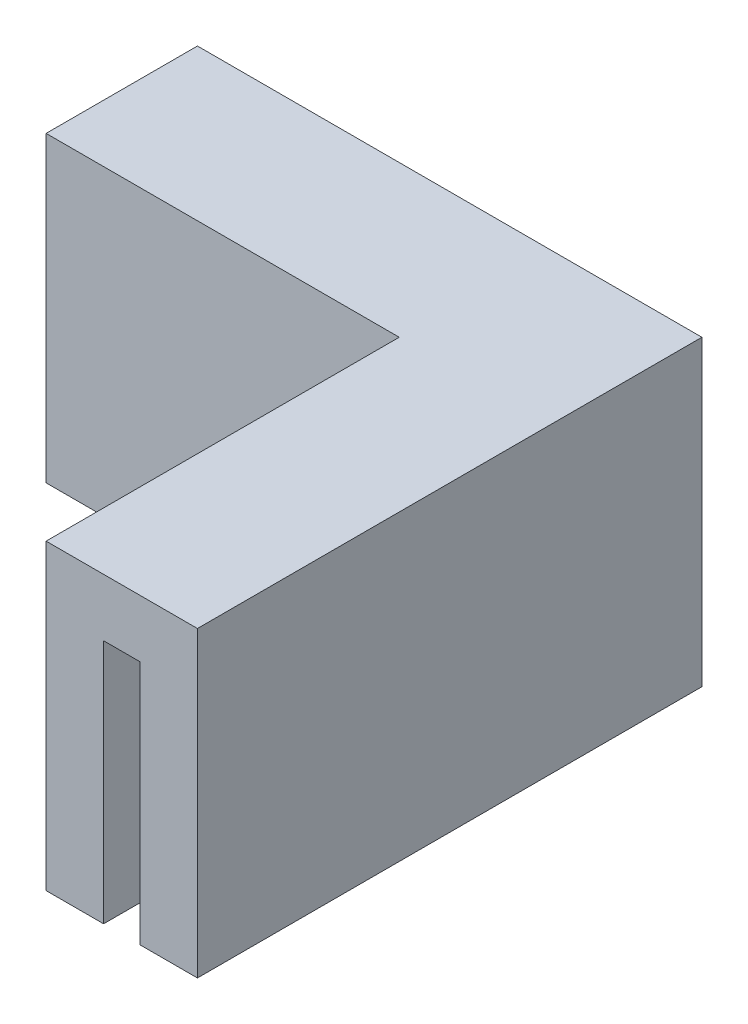
ISO-10303-21;
HEADER;
FILE_DESCRIPTION(('STEP AP214'),'2;1');
FILE_NAME('part.step','',(''),(''),'','','');
FILE_SCHEMA(('AUTOMOTIVE_DESIGN { 1 0 10303 214 1 1 1 1 }'));
ENDSEC;
DATA;
#1=APPLICATION_CONTEXT('core data for automotive mechanical design processes');
#2=APPLICATION_PROTOCOL_DEFINITION('international standard','automotive_design',2000,#1);
#3=PRODUCT_CONTEXT('',#1,'mechanical');
#4=PRODUCT('Part','Part','',(#3));
#5=PRODUCT_RELATED_PRODUCT_CATEGORY('part','',(#4));
#6=PRODUCT_DEFINITION_FORMATION('','',#4);
#7=PRODUCT_DEFINITION_CONTEXT('part definition',#1,'design');
#8=PRODUCT_DEFINITION('design','',#6,#7);
#9=PRODUCT_DEFINITION_SHAPE('','',#8);
#10=(LENGTH_UNIT() NAMED_UNIT(*) SI_UNIT(.MILLI.,.METRE.));
#11=(NAMED_UNIT(*) PLANE_ANGLE_UNIT() SI_UNIT($,.RADIAN.));
#12=(NAMED_UNIT(*) SI_UNIT($,.STERADIAN.) SOLID_ANGLE_UNIT());
#13=UNCERTAINTY_MEASURE_WITH_UNIT(LENGTH_MEASURE(1.E-05),#10,'distance_accuracy_value','');
#14=(GEOMETRIC_REPRESENTATION_CONTEXT(3) GLOBAL_UNCERTAINTY_ASSIGNED_CONTEXT((#13)) GLOBAL_UNIT_ASSIGNED_CONTEXT((#10,
#11,#12)) REPRESENTATION_CONTEXT('',''));
#15=CARTESIAN_POINT('',(0.,0.,0.));
#16=DIRECTION('',(0.,0.,1.));
#17=DIRECTION('',(1.,0.,0.));
#18=AXIS2_PLACEMENT_3D('',#15,#16,#17);
#19=CARTESIAN_POINT('',(44.3,24.3,5.7));
#20=DIRECTION('',(1.,0.,0.));
#21=DIRECTION('',(0.,0.,-1.));
#22=AXIS2_PLACEMENT_3D('',#19,#20,#21);
#23=PLANE('',#22);
#24=DIRECTION('',(0.,1.,0.));
#25=VECTOR('',#24,1.);
#26=CARTESIAN_POINT('',(44.3,0.,9.4));
#27=LINE('',#26,#25);
#28=CARTESIAN_POINT('',(44.3,0.,9.4));
#29=VERTEX_POINT('',#28);
#30=CARTESIAN_POINT('',(44.3,24.3,9.4));
#31=VERTEX_POINT('',#30);
#32=EDGE_CURVE('E138',#29,#31,#27,.T.);
#33=ORIENTED_EDGE('',*,*,#32,.F.);
#34=DIRECTION('',(0.,0.,1.));
#35=VECTOR('',#34,1.);
#36=CARTESIAN_POINT('',(44.3,0.,5.7));
#37=LINE('',#36,#35);
#38=CARTESIAN_POINT('',(44.3,0.,50.));
#39=VERTEX_POINT('',#38);
#40=EDGE_CURVE('E150',#29,#39,#37,.T.);
#41=ORIENTED_EDGE('',*,*,#40,.T.);
#42=DIRECTION('',(0.,-1.,0.));
#43=VECTOR('',#42,1.);
#44=CARTESIAN_POINT('',(44.3,24.3,50.));
#45=LINE('',#44,#43);
#46=CARTESIAN_POINT('',(44.3,24.3,50.));
#47=VERTEX_POINT('',#46);
#48=EDGE_CURVE('E170',#47,#39,#45,.T.);
#49=ORIENTED_EDGE('',*,*,#48,.F.);
#50=DIRECTION('',(0.,0.,1.));
#51=VECTOR('',#50,1.);
#52=CARTESIAN_POINT('',(44.3,24.3,5.7));
#53=LINE('',#52,#51);
#54=EDGE_CURVE('E152',#31,#47,#53,.T.);
#55=ORIENTED_EDGE('',*,*,#54,.F.);
#56=EDGE_LOOP('',(#33,#41,#49,#55));
#57=FACE_BOUND('',#56,.T.);
#58=ADVANCED_FACE('F35',(#57),#23,.F.);
#59=CARTESIAN_POINT('',(0.,24.3,5.7));
#60=DIRECTION('',(0.,0.,-1.));
#61=DIRECTION('',(-1.,0.,0.));
#62=AXIS2_PLACEMENT_3D('',#59,#60,#61);
#63=PLANE('',#62);
#64=DIRECTION('',(0.,1.,0.));
#65=VECTOR('',#64,1.);
#66=CARTESIAN_POINT('',(40.6,0.,5.7));
#67=LINE('',#66,#65);
#68=CARTESIAN_POINT('',(40.6,0.,5.7));
#69=VERTEX_POINT('',#68);
#70=CARTESIAN_POINT('',(40.6,24.3,5.7));
#71=VERTEX_POINT('',#70);
#72=EDGE_CURVE('E153',#69,#71,#67,.T.);
#73=ORIENTED_EDGE('',*,*,#72,.T.);
#74=DIRECTION('',(1.,0.,0.));
#75=VECTOR('',#74,1.);
#76=CARTESIAN_POINT('',(0.,24.3,5.7));
#77=LINE('',#76,#75);
#78=CARTESIAN_POINT('',(0.,24.3,5.7));
#79=VERTEX_POINT('',#78);
#80=EDGE_CURVE('E238',#79,#71,#77,.T.);
#81=ORIENTED_EDGE('',*,*,#80,.F.);
#82=DIRECTION('',(0.,-1.,0.));
#83=VECTOR('',#82,1.);
#84=CARTESIAN_POINT('',(0.,24.3,5.7));
#85=LINE('',#84,#83);
#86=CARTESIAN_POINT('',(0.,0.,5.7));
#87=VERTEX_POINT('',#86);
#88=EDGE_CURVE('E173',#79,#87,#85,.T.);
#89=ORIENTED_EDGE('',*,*,#88,.T.);
#90=DIRECTION('',(1.,0.,0.));
#91=VECTOR('',#90,1.);
#92=CARTESIAN_POINT('',(0.,0.,5.7));
#93=LINE('',#92,#91);
#94=EDGE_CURVE('E160',#87,#69,#93,.T.);
#95=ORIENTED_EDGE('',*,*,#94,.T.);
#96=EDGE_LOOP('',(#73,#81,#89,#95));
#97=FACE_BOUND('',#96,.T.);
#98=ADVANCED_FACE('F236',(#97),#63,.F.);
#99=CARTESIAN_POINT('',(40.7,24.3,9.3));
#100=DIRECTION('',(0.,0.,1.));
#101=DIRECTION('',(1.,0.,0.));
#102=AXIS2_PLACEMENT_3D('',#99,#100,#101);
#103=PLANE('',#102);
#104=DIRECTION('',(0.,1.,0.));
#105=VECTOR('',#104,1.);
#106=CARTESIAN_POINT('',(40.6,24.3,9.3));
#107=LINE('',#106,#105);
#108=CARTESIAN_POINT('',(40.6,0.,9.3));
#109=VERTEX_POINT('',#108);
#110=CARTESIAN_POINT('',(40.6,24.3,9.3));
#111=VERTEX_POINT('',#110);
#112=EDGE_CURVE('E50',#109,#111,#107,.T.);
#113=ORIENTED_EDGE('',*,*,#112,.F.);
#114=DIRECTION('',(-1.,0.,0.));
#115=VECTOR('',#114,1.);
#116=CARTESIAN_POINT('',(40.7,0.,9.3));
#117=LINE('',#116,#115);
#118=CARTESIAN_POINT('',(0.,0.,9.3));
#119=VERTEX_POINT('',#118);
#120=EDGE_CURVE('E166',#109,#119,#117,.T.);
#121=ORIENTED_EDGE('',*,*,#120,.T.);
#122=DIRECTION('',(0.,-1.,0.));
#123=VECTOR('',#122,1.);
#124=CARTESIAN_POINT('',(0.,24.3,9.3));
#125=LINE('',#124,#123);
#126=CARTESIAN_POINT('',(0.,24.3,9.3));
#127=VERTEX_POINT('',#126);
#128=EDGE_CURVE('E175',#127,#119,#125,.T.);
#129=ORIENTED_EDGE('',*,*,#128,.F.);
#130=DIRECTION('',(-1.,0.,0.));
#131=VECTOR('',#130,1.);
#132=CARTESIAN_POINT('',(40.7,24.3,9.3));
#133=LINE('',#132,#131);
#134=EDGE_CURVE('E245',#111,#127,#133,.T.);
#135=ORIENTED_EDGE('',*,*,#134,.F.);
#136=EDGE_LOOP('',(#113,#121,#129,#135));
#137=FACE_BOUND('',#136,.T.);
#138=ADVANCED_FACE('F254',(#137),#103,.F.);
#139=CARTESIAN_POINT('',(40.7,24.3,50.));
#140=DIRECTION('',(-1.,0.,0.));
#141=DIRECTION('',(0.,0.,1.));
#142=AXIS2_PLACEMENT_3D('',#139,#140,#141);
#143=PLANE('',#142);
#144=DIRECTION('',(0.,-1.,0.));
#145=VECTOR('',#144,1.);
#146=CARTESIAN_POINT('',(40.7,24.3,9.4));
#147=LINE('',#146,#145);
#148=CARTESIAN_POINT('',(40.7,24.3,9.4));
#149=VERTEX_POINT('',#148);
#150=CARTESIAN_POINT('',(40.7,0.,9.4));
#151=VERTEX_POINT('',#150);
#152=EDGE_CURVE('E141',#149,#151,#147,.T.);
#153=ORIENTED_EDGE('',*,*,#152,.F.);
#154=DIRECTION('',(0.,0.,-1.));
#155=VECTOR('',#154,1.);
#156=CARTESIAN_POINT('',(40.7,24.3,50.));
#157=LINE('',#156,#155);
#158=CARTESIAN_POINT('',(40.7,24.3,50.));
#159=VERTEX_POINT('',#158);
#160=EDGE_CURVE('E163',#159,#149,#157,.T.);
#161=ORIENTED_EDGE('',*,*,#160,.F.);
#162=DIRECTION('',(0.,-1.,0.));
#163=VECTOR('',#162,1.);
#164=CARTESIAN_POINT('',(40.7,24.3,50.));
#165=LINE('',#164,#163);
#166=CARTESIAN_POINT('',(40.7,0.,50.));
#167=VERTEX_POINT('',#166);
#168=EDGE_CURVE('E57',#159,#167,#165,.T.);
#169=ORIENTED_EDGE('',*,*,#168,.T.);
#170=DIRECTION('',(0.,0.,-1.));
#171=VECTOR('',#170,1.);
#172=CARTESIAN_POINT('',(40.7,0.,50.));
#173=LINE('',#172,#171);
#174=EDGE_CURVE('E252',#167,#151,#173,.T.);
#175=ORIENTED_EDGE('',*,*,#174,.T.);
#176=EDGE_LOOP('',(#153,#161,#169,#175));
#177=FACE_BOUND('',#176,.T.);
#178=ADVANCED_FACE('F282',(#177),#143,.F.);
#179=CARTESIAN_POINT('',(0.,24.3,0.));
#180=DIRECTION('',(0.,-1.,0.));
#181=DIRECTION('',(0.,0.,-1.));
#182=AXIS2_PLACEMENT_3D('',#179,#180,#181);
#183=PLANE('',#182);
#184=ORIENTED_EDGE('',*,*,#160,.T.);
#185=DIRECTION('',(-1.,0.,0.));
#186=VECTOR('',#185,1.);
#187=CARTESIAN_POINT('',(44.3,24.3,9.4));
#188=LINE('',#187,#186);
#189=EDGE_CURVE('E145',#31,#149,#188,.T.);
#190=ORIENTED_EDGE('',*,*,#189,.F.);
#191=ORIENTED_EDGE('',*,*,#54,.T.);
#192=DIRECTION('',(-1.,0.,0.));
#193=VECTOR('',#192,1.);
#194=CARTESIAN_POINT('',(44.3,24.3,50.));
#195=LINE('',#194,#193);
#196=EDGE_CURVE('E159',#47,#159,#195,.T.);
#197=ORIENTED_EDGE('',*,*,#196,.T.);
#198=EDGE_LOOP('',(#184,#190,#191,#197));
#199=FACE_BOUND('',#198,.T.);
#200=ADVANCED_FACE('F276',(#199),#183,.T.);
#201=ORIENTED_EDGE('',*,*,#80,.T.);
#202=DIRECTION('',(0.,0.,1.));
#203=VECTOR('',#202,1.);
#204=CARTESIAN_POINT('',(40.6,24.3,0.));
#205=LINE('',#204,#203);
#206=EDGE_CURVE('E11',#71,#111,#205,.T.);
#207=ORIENTED_EDGE('',*,*,#206,.T.);
#208=ORIENTED_EDGE('',*,*,#134,.T.);
#209=DIRECTION('',(0.,0.,-1.));
#210=VECTOR('',#209,1.);
#211=CARTESIAN_POINT('',(0.,24.3,5.7));
#212=LINE('',#211,#210);
#213=EDGE_CURVE('E241',#127,#79,#212,.T.);
#214=ORIENTED_EDGE('',*,*,#213,.T.);
#215=EDGE_LOOP('',(#201,#207,#208,#214));
#216=FACE_BOUND('',#215,.T.);
#217=ADVANCED_FACE('F324',(#216),#183,.T.);
#218=CARTESIAN_POINT('',(0.,30.,0.));
#219=DIRECTION('',(0.,0.,1.));
#220=DIRECTION('',(1.,0.,0.));
#221=AXIS2_PLACEMENT_3D('',#218,#219,#220);
#222=PLANE('',#221);
#223=DIRECTION('',(-1.,0.,0.));
#224=VECTOR('',#223,1.);
#225=CARTESIAN_POINT('',(0.,0.,0.));
#226=LINE('',#225,#224);
#227=CARTESIAN_POINT('',(50.,0.,0.));
#228=VERTEX_POINT('',#227);
#229=CARTESIAN_POINT('',(0.,0.,0.));
#230=VERTEX_POINT('',#229);
#231=EDGE_CURVE('E172',#228,#230,#226,.T.);
#232=ORIENTED_EDGE('',*,*,#231,.T.);
#233=DIRECTION('',(0.,-1.,0.));
#234=VECTOR('',#233,1.);
#235=CARTESIAN_POINT('',(0.,30.,0.));
#236=LINE('',#235,#234);
#237=CARTESIAN_POINT('',(0.,30.,0.));
#238=VERTEX_POINT('',#237);
#239=EDGE_CURVE('E43',#238,#230,#236,.T.);
#240=ORIENTED_EDGE('',*,*,#239,.F.);
#241=DIRECTION('',(-1.,0.,0.));
#242=VECTOR('',#241,1.);
#243=CARTESIAN_POINT('',(0.,30.,0.));
#244=LINE('',#243,#242);
#245=CARTESIAN_POINT('',(50.,30.,0.));
#246=VERTEX_POINT('',#245);
#247=EDGE_CURVE('E179',#246,#238,#244,.T.);
#248=ORIENTED_EDGE('',*,*,#247,.F.);
#249=DIRECTION('',(0.,-1.,0.));
#250=VECTOR('',#249,1.);
#251=CARTESIAN_POINT('',(50.,30.,0.));
#252=LINE('',#251,#250);
#253=EDGE_CURVE('E193',#246,#228,#252,.T.);
#254=ORIENTED_EDGE('',*,*,#253,.T.);
#255=EDGE_LOOP('',(#232,#240,#248,#254));
#256=FACE_BOUND('',#255,.T.);
#257=ADVANCED_FACE('F37',(#256),#222,.F.);
#258=CARTESIAN_POINT('',(0.,30.,0.));
#259=DIRECTION('',(1.,0.,0.));
#260=DIRECTION('',(0.,0.,-1.));
#261=AXIS2_PLACEMENT_3D('',#258,#259,#260);
#262=PLANE('',#261);
#263=DIRECTION('',(0.,0.,1.));
#264=VECTOR('',#263,1.);
#265=CARTESIAN_POINT('',(0.,0.,0.));
#266=LINE('',#265,#264);
#267=EDGE_CURVE('E197',#230,#87,#266,.T.);
#268=ORIENTED_EDGE('',*,*,#267,.T.);
#269=ORIENTED_EDGE('',*,*,#88,.F.);
#270=ORIENTED_EDGE('',*,*,#213,.F.);
#271=ORIENTED_EDGE('',*,*,#128,.T.);
#272=CARTESIAN_POINT('',(0.,0.,15.));
#273=VERTEX_POINT('',#272);
#274=EDGE_CURVE('E196',#119,#273,#266,.T.);
#275=ORIENTED_EDGE('',*,*,#274,.T.);
#276=DIRECTION('',(0.,-1.,0.));
#277=VECTOR('',#276,1.);
#278=CARTESIAN_POINT('',(0.,30.,15.));
#279=LINE('',#278,#277);
#280=CARTESIAN_POINT('',(0.,30.,15.));
#281=VERTEX_POINT('',#280);
#282=EDGE_CURVE('E219',#281,#273,#279,.T.);
#283=ORIENTED_EDGE('',*,*,#282,.F.);
#284=DIRECTION('',(0.,0.,1.));
#285=VECTOR('',#284,1.);
#286=CARTESIAN_POINT('',(0.,30.,0.));
#287=LINE('',#286,#285);
#288=EDGE_CURVE('E182',#238,#281,#287,.T.);
#289=ORIENTED_EDGE('',*,*,#288,.F.);
#290=ORIENTED_EDGE('',*,*,#239,.T.);
#291=EDGE_LOOP('',(#268,#269,#270,#271,#275,#283,#289,#290));
#292=FACE_BOUND('',#291,.T.);
#293=ADVANCED_FACE('F224',(#292),#262,.F.);
#294=CARTESIAN_POINT('',(0.,30.,15.));
#295=DIRECTION('',(0.,0.,-1.));
#296=DIRECTION('',(-1.,0.,0.));
#297=AXIS2_PLACEMENT_3D('',#294,#295,#296);
#298=PLANE('',#297);
#299=DIRECTION('',(1.,0.,0.));
#300=VECTOR('',#299,1.);
#301=CARTESIAN_POINT('',(0.,0.,15.));
#302=LINE('',#301,#300);
#303=CARTESIAN_POINT('',(35.,0.,15.));
#304=VERTEX_POINT('',#303);
#305=EDGE_CURVE('E200',#273,#304,#302,.T.);
#306=ORIENTED_EDGE('',*,*,#305,.T.);
#307=DIRECTION('',(0.,-1.,0.));
#308=VECTOR('',#307,1.);
#309=CARTESIAN_POINT('',(35.,30.,15.));
#310=LINE('',#309,#308);
#311=CARTESIAN_POINT('',(35.,30.,15.));
#312=VERTEX_POINT('',#311);
#313=EDGE_CURVE('E216',#312,#304,#310,.T.);
#314=ORIENTED_EDGE('',*,*,#313,.F.);
#315=DIRECTION('',(1.,0.,0.));
#316=VECTOR('',#315,1.);
#317=CARTESIAN_POINT('',(0.,30.,15.));
#318=LINE('',#317,#316);
#319=EDGE_CURVE('E185',#281,#312,#318,.T.);
#320=ORIENTED_EDGE('',*,*,#319,.F.);
#321=ORIENTED_EDGE('',*,*,#282,.T.);
#322=EDGE_LOOP('',(#306,#314,#320,#321));
#323=FACE_BOUND('',#322,.T.);
#324=ADVANCED_FACE('F260',(#323),#298,.F.);
#325=CARTESIAN_POINT('',(35.,30.,15.));
#326=DIRECTION('',(1.,0.,0.));
#327=DIRECTION('',(0.,0.,-1.));
#328=AXIS2_PLACEMENT_3D('',#325,#326,#327);
#329=PLANE('',#328);
#330=DIRECTION('',(0.,0.,1.));
#331=VECTOR('',#330,1.);
#332=CARTESIAN_POINT('',(35.,0.,15.));
#333=LINE('',#332,#331);
#334=CARTESIAN_POINT('',(35.,0.,50.));
#335=VERTEX_POINT('',#334);
#336=EDGE_CURVE('E202',#304,#335,#333,.T.);
#337=ORIENTED_EDGE('',*,*,#336,.T.);
#338=DIRECTION('',(0.,-1.,0.));
#339=VECTOR('',#338,1.);
#340=CARTESIAN_POINT('',(35.,30.,50.));
#341=LINE('',#340,#339);
#342=CARTESIAN_POINT('',(35.,30.,50.));
#343=VERTEX_POINT('',#342);
#344=EDGE_CURVE('E213',#343,#335,#341,.T.);
#345=ORIENTED_EDGE('',*,*,#344,.F.);
#346=DIRECTION('',(0.,0.,1.));
#347=VECTOR('',#346,1.);
#348=CARTESIAN_POINT('',(35.,30.,15.));
#349=LINE('',#348,#347);
#350=EDGE_CURVE('E187',#312,#343,#349,.T.);
#351=ORIENTED_EDGE('',*,*,#350,.F.);
#352=ORIENTED_EDGE('',*,*,#313,.T.);
#353=EDGE_LOOP('',(#337,#345,#351,#352));
#354=FACE_BOUND('',#353,.T.);
#355=ADVANCED_FACE('F285',(#354),#329,.F.);
#356=CARTESIAN_POINT('',(50.,30.,50.));
#357=DIRECTION('',(0.,0.,-1.));
#358=DIRECTION('',(-1.,0.,0.));
#359=AXIS2_PLACEMENT_3D('',#356,#357,#358);
#360=PLANE('',#359);
#361=ORIENTED_EDGE('',*,*,#196,.F.);
#362=ORIENTED_EDGE('',*,*,#48,.T.);
#363=DIRECTION('',(1.,0.,0.));
#364=VECTOR('',#363,1.);
#365=CARTESIAN_POINT('',(50.,0.,50.));
#366=LINE('',#365,#364);
#367=CARTESIAN_POINT('',(50.,0.,50.));
#368=VERTEX_POINT('',#367);
#369=EDGE_CURVE('E158',#39,#368,#366,.T.);
#370=ORIENTED_EDGE('',*,*,#369,.T.);
#371=DIRECTION('',(0.,-1.,0.));
#372=VECTOR('',#371,1.);
#373=CARTESIAN_POINT('',(50.,30.,50.));
#374=LINE('',#373,#372);
#375=CARTESIAN_POINT('',(50.,30.,50.));
#376=VERTEX_POINT('',#375);
#377=EDGE_CURVE('E210',#376,#368,#374,.T.);
#378=ORIENTED_EDGE('',*,*,#377,.F.);
#379=DIRECTION('',(1.,0.,0.));
#380=VECTOR('',#379,1.);
#381=CARTESIAN_POINT('',(50.,30.,50.));
#382=LINE('',#381,#380);
#383=EDGE_CURVE('E189',#343,#376,#382,.T.);
#384=ORIENTED_EDGE('',*,*,#383,.F.);
#385=ORIENTED_EDGE('',*,*,#344,.T.);
#386=EDGE_CURVE('E204',#335,#167,#366,.T.);
#387=ORIENTED_EDGE('',*,*,#386,.T.);
#388=ORIENTED_EDGE('',*,*,#168,.F.);
#389=EDGE_LOOP('',(#361,#362,#370,#378,#384,#385,#387,#388));
#390=FACE_BOUND('',#389,.T.);
#391=ADVANCED_FACE('F273',(#390),#360,.F.);
#392=CARTESIAN_POINT('',(50.,30.,0.));
#393=DIRECTION('',(-1.,0.,0.));
#394=DIRECTION('',(0.,0.,1.));
#395=AXIS2_PLACEMENT_3D('',#392,#393,#394);
#396=PLANE('',#395);
#397=DIRECTION('',(0.,0.,-1.));
#398=VECTOR('',#397,1.);
#399=CARTESIAN_POINT('',(50.,0.,0.));
#400=LINE('',#399,#398);
#401=EDGE_CURVE('E183',#368,#228,#400,.T.);
#402=ORIENTED_EDGE('',*,*,#401,.T.);
#403=ORIENTED_EDGE('',*,*,#253,.F.);
#404=DIRECTION('',(0.,0.,-1.));
#405=VECTOR('',#404,1.);
#406=CARTESIAN_POINT('',(50.,30.,0.));
#407=LINE('',#406,#405);
#408=EDGE_CURVE('E191',#376,#246,#407,.T.);
#409=ORIENTED_EDGE('',*,*,#408,.F.);
#410=ORIENTED_EDGE('',*,*,#377,.T.);
#411=EDGE_LOOP('',(#402,#403,#409,#410));
#412=FACE_BOUND('',#411,.T.);
#413=ADVANCED_FACE('F270',(#412),#396,.F.);
#414=CARTESIAN_POINT('',(0.,30.,0.));
#415=DIRECTION('',(0.,-1.,0.));
#416=DIRECTION('',(0.,0.,-1.));
#417=AXIS2_PLACEMENT_3D('',#414,#415,#416);
#418=PLANE('',#417);
#419=ORIENTED_EDGE('',*,*,#247,.T.);
#420=ORIENTED_EDGE('',*,*,#288,.T.);
#421=ORIENTED_EDGE('',*,*,#319,.T.);
#422=ORIENTED_EDGE('',*,*,#350,.T.);
#423=ORIENTED_EDGE('',*,*,#383,.T.);
#424=ORIENTED_EDGE('',*,*,#408,.T.);
#425=EDGE_LOOP('',(#419,#420,#421,#422,#423,#424));
#426=FACE_BOUND('',#425,.T.);
#427=ADVANCED_FACE('F264',(#426),#418,.F.);
#428=CARTESIAN_POINT('',(0.,0.,0.));
#429=DIRECTION('',(0.,-1.,0.));
#430=DIRECTION('',(0.,0.,-1.));
#431=AXIS2_PLACEMENT_3D('',#428,#429,#430);
#432=PLANE('',#431);
#433=DIRECTION('',(-1.,0.,0.));
#434=VECTOR('',#433,1.);
#435=CARTESIAN_POINT('',(44.3,0.,9.4));
#436=LINE('',#435,#434);
#437=EDGE_CURVE('E135',#29,#151,#436,.T.);
#438=ORIENTED_EDGE('',*,*,#437,.T.);
#439=ORIENTED_EDGE('',*,*,#174,.F.);
#440=ORIENTED_EDGE('',*,*,#386,.F.);
#441=ORIENTED_EDGE('',*,*,#336,.F.);
#442=ORIENTED_EDGE('',*,*,#305,.F.);
#443=ORIENTED_EDGE('',*,*,#274,.F.);
#444=ORIENTED_EDGE('',*,*,#120,.F.);
#445=DIRECTION('',(0.,0.,-1.));
#446=VECTOR('',#445,1.);
#447=CARTESIAN_POINT('',(40.6,0.,5.7));
#448=LINE('',#447,#446);
#449=EDGE_CURVE('E144',#109,#69,#448,.T.);
#450=ORIENTED_EDGE('',*,*,#449,.T.);
#451=ORIENTED_EDGE('',*,*,#94,.F.);
#452=ORIENTED_EDGE('',*,*,#267,.F.);
#453=ORIENTED_EDGE('',*,*,#231,.F.);
#454=ORIENTED_EDGE('',*,*,#401,.F.);
#455=ORIENTED_EDGE('',*,*,#369,.F.);
#456=ORIENTED_EDGE('',*,*,#40,.F.);
#457=EDGE_LOOP('',(#438,#439,#440,#441,#442,#443,#444,#450,#451,#452,#453,#454,#455,#456));
#458=FACE_BOUND('',#457,.T.);
#459=ADVANCED_FACE('F156',(#458),#432,.T.);
#460=CARTESIAN_POINT('',(44.3,0.,9.4));
#461=DIRECTION('',(0.,0.,-1.));
#462=DIRECTION('',(-1.,0.,0.));
#463=AXIS2_PLACEMENT_3D('',#460,#461,#462);
#464=PLANE('',#463);
#465=ORIENTED_EDGE('',*,*,#189,.T.);
#466=ORIENTED_EDGE('',*,*,#152,.T.);
#467=ORIENTED_EDGE('',*,*,#437,.F.);
#468=ORIENTED_EDGE('',*,*,#32,.T.);
#469=EDGE_LOOP('',(#465,#466,#467,#468));
#470=FACE_BOUND('',#469,.T.);
#471=ADVANCED_FACE('F137',(#470),#464,.F.);
#472=CARTESIAN_POINT('',(40.6,0.,5.7));
#473=DIRECTION('',(1.,0.,0.));
#474=DIRECTION('',(0.,0.,-1.));
#475=AXIS2_PLACEMENT_3D('',#472,#473,#474);
#476=PLANE('',#475);
#477=ORIENTED_EDGE('',*,*,#449,.F.);
#478=ORIENTED_EDGE('',*,*,#112,.T.);
#479=ORIENTED_EDGE('',*,*,#206,.F.);
#480=ORIENTED_EDGE('',*,*,#72,.F.);
#481=EDGE_LOOP('',(#477,#478,#479,#480));
#482=FACE_BOUND('',#481,.T.);
#483=ADVANCED_FACE('F364',(#482),#476,.F.);
#484=CLOSED_SHELL('',(#58,#98,#138,#178,#200,#217,#257,#293,#324,#355,#391,#413,#427,#459,#471,#483));
#485=MANIFOLD_SOLID_BREP('B2',#484);
#486=ADVANCED_BREP_SHAPE_REPRESENTATION('',(#18,#485),#14);
#487=SHAPE_DEFINITION_REPRESENTATION(#9,#486);
ENDSEC;
END-ISO-10303-21;
